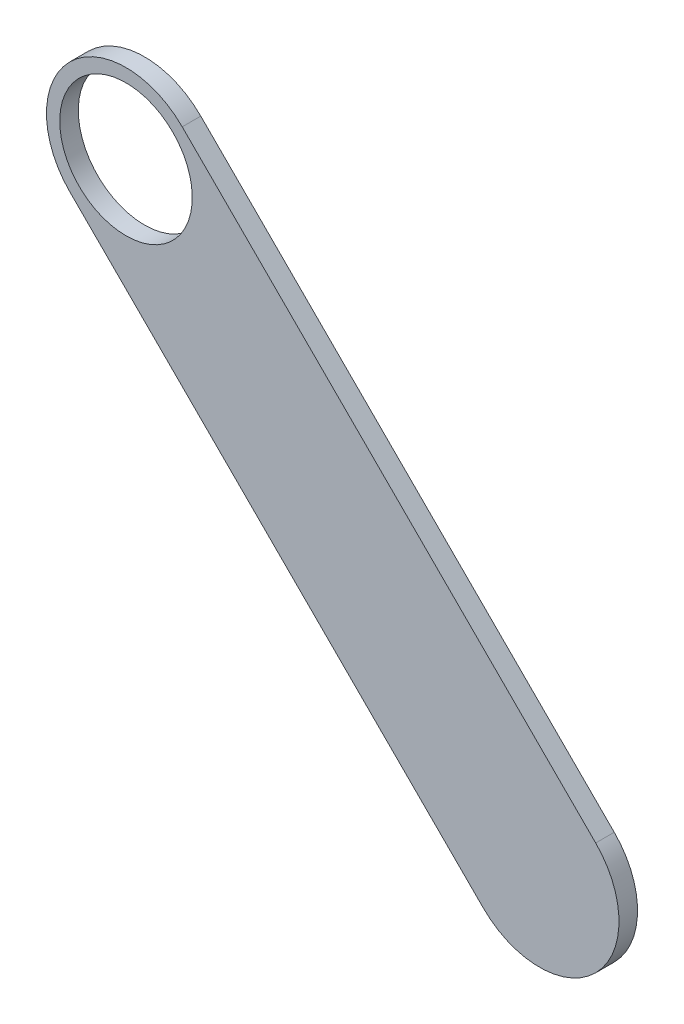
ISO-10303-21;
HEADER;
FILE_DESCRIPTION(('STEP AP214'),'2;1');
FILE_NAME('part.step','',(''),(''),'','','');
FILE_SCHEMA(('AUTOMOTIVE_DESIGN { 1 0 10303 214 1 1 1 1 }'));
ENDSEC;
DATA;
#1=APPLICATION_CONTEXT('core data for automotive mechanical design processes');
#2=APPLICATION_PROTOCOL_DEFINITION('international standard','automotive_design',2000,#1);
#3=PRODUCT_CONTEXT('',#1,'mechanical');
#4=PRODUCT('Part','Part','',(#3));
#5=PRODUCT_RELATED_PRODUCT_CATEGORY('part','',(#4));
#6=PRODUCT_DEFINITION_FORMATION('','',#4);
#7=PRODUCT_DEFINITION_CONTEXT('part definition',#1,'design');
#8=PRODUCT_DEFINITION('design','',#6,#7);
#9=PRODUCT_DEFINITION_SHAPE('','',#8);
#10=(LENGTH_UNIT() NAMED_UNIT(*) SI_UNIT(.MILLI.,.METRE.));
#11=(NAMED_UNIT(*) PLANE_ANGLE_UNIT() SI_UNIT($,.RADIAN.));
#12=(NAMED_UNIT(*) SI_UNIT($,.STERADIAN.) SOLID_ANGLE_UNIT());
#13=UNCERTAINTY_MEASURE_WITH_UNIT(LENGTH_MEASURE(1.E-05),#10,'distance_accuracy_value','');
#14=(GEOMETRIC_REPRESENTATION_CONTEXT(3) GLOBAL_UNCERTAINTY_ASSIGNED_CONTEXT((#13)) GLOBAL_UNIT_ASSIGNED_CONTEXT((#10,
#11,#12)) REPRESENTATION_CONTEXT('',''));
#15=CARTESIAN_POINT('',(0.,0.,0.));
#16=DIRECTION('',(0.,0.,1.));
#17=DIRECTION('',(1.,0.,0.));
#18=AXIS2_PLACEMENT_3D('',#15,#16,#17);
#19=CARTESIAN_POINT('',(132.67,-119.85,-0.045));
#20=DIRECTION('',(0.,0.,-1.));
#21=DIRECTION('',(0.,-1.,0.));
#22=AXIS2_PLACEMENT_3D('',#19,#20,#21);
#23=CYLINDRICAL_SURFACE('',#22,0.125);
#24=CARTESIAN_POINT('',(132.67,-119.85,-0.035));
#25=DIRECTION('',(0.,0.,-1.));
#26=DIRECTION('',(0.,-1.,0.));
#27=AXIS2_PLACEMENT_3D('',#24,#25,#26);
#28=CIRCLE('',#27,0.125);
#29=CARTESIAN_POINT('',(132.67,-119.975,-0.035));
#30=VERTEX_POINT('',#29);
#31=EDGE_CURVE('E86',#30,#30,#28,.T.);
#32=ORIENTED_EDGE('',*,*,#31,.T.);
#33=DIRECTION('',(0.,0.,1.));
#34=VECTOR('',#33,1.);
#35=CARTESIAN_POINT('',(132.67,-119.975,-0.045));
#36=LINE('',#35,#34);
#37=CARTESIAN_POINT('',(132.67,-119.975,0.));
#38=VERTEX_POINT('',#37);
#39=EDGE_CURVE('E11',#30,#38,#36,.T.);
#40=ORIENTED_EDGE('',*,*,#39,.T.);
#41=CARTESIAN_POINT('',(132.67,-119.85,0.));
#42=DIRECTION('',(0.,0.,-1.));
#43=DIRECTION('',(0.,-1.,0.));
#44=AXIS2_PLACEMENT_3D('',#41,#42,#43);
#45=CIRCLE('',#44,0.125);
#46=EDGE_CURVE('E25',#38,#38,#45,.T.);
#47=ORIENTED_EDGE('',*,*,#46,.F.);
#48=ORIENTED_EDGE('',*,*,#39,.F.);
#49=EDGE_LOOP('',(#32,#40,#47,#48));
#50=FACE_BOUND('',#49,.T.);
#51=ADVANCED_FACE('F17',(#50),#23,.F.);
#52=CARTESIAN_POINT('',(132.563933,-119.956066,-0.035));
#53=DIRECTION('',(0.707106781186548,0.707106781186548,0.));
#54=DIRECTION('',(0.,0.,-1.));
#55=AXIS2_PLACEMENT_3D('',#52,#53,#54);
#56=PLANE('',#55);
#57=DIRECTION('',(0.707106781186548,-0.707106781186548,0.));
#58=VECTOR('',#57,1.);
#59=CARTESIAN_POINT('',(132.563933,-119.956066,-0.035));
#60=LINE('',#59,#58);
#61=CARTESIAN_POINT('',(132.563933,-119.956066,-0.035));
#62=VERTEX_POINT('',#61);
#63=CARTESIAN_POINT('',(133.343933,-120.736066,-0.035));
#64=VERTEX_POINT('',#63);
#65=EDGE_CURVE('E91',#62,#64,#60,.T.);
#66=ORIENTED_EDGE('',*,*,#65,.T.);
#67=DIRECTION('',(0.,0.,1.));
#68=VECTOR('',#67,1.);
#69=CARTESIAN_POINT('',(133.343933,-120.736066,-0.035));
#70=LINE('',#69,#68);
#71=CARTESIAN_POINT('',(133.343933,-120.736066,0.));
#72=VERTEX_POINT('',#71);
#73=EDGE_CURVE('E89',#64,#72,#70,.T.);
#74=ORIENTED_EDGE('',*,*,#73,.T.);
#75=DIRECTION('',(0.707106781186548,-0.707106781186548,0.));
#76=VECTOR('',#75,1.);
#77=CARTESIAN_POINT('',(132.563933,-119.956066,0.));
#78=LINE('',#77,#76);
#79=CARTESIAN_POINT('',(132.563933,-119.956066,0.));
#80=VERTEX_POINT('',#79);
#81=EDGE_CURVE('E74',#80,#72,#78,.T.);
#82=ORIENTED_EDGE('',*,*,#81,.F.);
#83=DIRECTION('',(0.,0.,1.));
#84=VECTOR('',#83,1.);
#85=CARTESIAN_POINT('',(132.563933,-119.956066,-0.035));
#86=LINE('',#85,#84);
#87=EDGE_CURVE('E116',#62,#80,#86,.T.);
#88=ORIENTED_EDGE('',*,*,#87,.F.);
#89=EDGE_LOOP('',(#66,#74,#82,#88));
#90=FACE_BOUND('',#89,.T.);
#91=ADVANCED_FACE('F90',(#90),#56,.F.);
#92=CARTESIAN_POINT('',(133.556066,-120.523933,0.));
#93=DIRECTION('',(0.,0.,1.));
#94=DIRECTION('',(1.,0.,0.));
#95=AXIS2_PLACEMENT_3D('',#92,#93,#94);
#96=PLANE('',#95);
#97=ORIENTED_EDGE('',*,*,#46,.T.);
#98=EDGE_LOOP('',(#97));
#99=FACE_BOUND('',#98,.T.);
#100=DIRECTION('',(-0.707106781186548,0.707106781186548,0.));
#101=VECTOR('',#100,1.);
#102=CARTESIAN_POINT('',(133.556066,-120.523933,0.));
#103=LINE('',#102,#101);
#104=CARTESIAN_POINT('',(133.556066,-120.523933,0.));
#105=VERTEX_POINT('',#104);
#106=CARTESIAN_POINT('',(132.776066,-119.743933,0.));
#107=VERTEX_POINT('',#106);
#108=EDGE_CURVE('E165',#105,#107,#103,.T.);
#109=ORIENTED_EDGE('',*,*,#108,.T.);
#110=CARTESIAN_POINT('',(132.6699995,-119.8499995,0.));
#111=DIRECTION('',(0.,0.,1.));
#112=DIRECTION('',(0.707106781186548,0.707106781186548,0.));
#113=AXIS2_PLACEMENT_3D('',#110,#111,#112);
#114=CIRCLE('',#113,0.150000682813);
#115=EDGE_CURVE('E81',#107,#80,#114,.T.);
#116=ORIENTED_EDGE('',*,*,#115,.T.);
#117=ORIENTED_EDGE('',*,*,#81,.T.);
#118=CARTESIAN_POINT('',(133.4499995,-120.6299995,0.));
#119=DIRECTION('',(0.,0.,1.));
#120=DIRECTION('',(-0.707106781186548,-0.707106781186548,0.));
#121=AXIS2_PLACEMENT_3D('',#118,#119,#120);
#122=CIRCLE('',#121,0.150000682813);
#123=EDGE_CURVE('E79',#72,#105,#122,.T.);
#124=ORIENTED_EDGE('',*,*,#123,.T.);
#125=EDGE_LOOP('',(#109,#116,#117,#124));
#126=FACE_BOUND('',#125,.T.);
#127=ADVANCED_FACE('F77',(#99,#126),#96,.T.);
#128=CARTESIAN_POINT('',(133.556066,-120.523933,-0.035));
#129=DIRECTION('',(0.,0.,1.));
#130=DIRECTION('',(1.,0.,0.));
#131=AXIS2_PLACEMENT_3D('',#128,#129,#130);
#132=PLANE('',#131);
#133=ORIENTED_EDGE('',*,*,#31,.F.);
#134=EDGE_LOOP('',(#133));
#135=FACE_BOUND('',#134,.T.);
#136=CARTESIAN_POINT('',(133.4499995,-120.6299995,-0.035));
#137=DIRECTION('',(0.,0.,1.));
#138=DIRECTION('',(-0.707106781186548,-0.707106781186548,0.));
#139=AXIS2_PLACEMENT_3D('',#136,#137,#138);
#140=CIRCLE('',#139,0.150000682813);
#141=CARTESIAN_POINT('',(133.556066,-120.523933,-0.035));
#142=VERTEX_POINT('',#141);
#143=EDGE_CURVE('E102',#64,#142,#140,.T.);
#144=ORIENTED_EDGE('',*,*,#143,.F.);
#145=ORIENTED_EDGE('',*,*,#65,.F.);
#146=CARTESIAN_POINT('',(132.6699995,-119.8499995,-0.035));
#147=DIRECTION('',(0.,0.,1.));
#148=DIRECTION('',(0.707106781186548,0.707106781186548,0.));
#149=AXIS2_PLACEMENT_3D('',#146,#147,#148);
#150=CIRCLE('',#149,0.150000682813);
#151=CARTESIAN_POINT('',(132.776066,-119.743933,-0.035));
#152=VERTEX_POINT('',#151);
#153=EDGE_CURVE('E95',#152,#62,#150,.T.);
#154=ORIENTED_EDGE('',*,*,#153,.F.);
#155=DIRECTION('',(-0.707106781186548,0.707106781186548,0.));
#156=VECTOR('',#155,1.);
#157=CARTESIAN_POINT('',(133.556066,-120.523933,-0.035));
#158=LINE('',#157,#156);
#159=EDGE_CURVE('E156',#142,#152,#158,.T.);
#160=ORIENTED_EDGE('',*,*,#159,.F.);
#161=EDGE_LOOP('',(#144,#145,#154,#160));
#162=FACE_BOUND('',#161,.T.);
#163=ADVANCED_FACE('F135',(#135,#162),#132,.F.);
#164=CARTESIAN_POINT('',(132.6699995,-119.8499995,-0.035));
#165=DIRECTION('',(0.,0.,-1.));
#166=DIRECTION('',(0.707106781186548,0.707106781186548,0.));
#167=AXIS2_PLACEMENT_3D('',#164,#165,#166);
#168=CYLINDRICAL_SURFACE('',#167,0.150000682813);
#169=ORIENTED_EDGE('',*,*,#153,.T.);
#170=ORIENTED_EDGE('',*,*,#87,.T.);
#171=ORIENTED_EDGE('',*,*,#115,.F.);
#172=DIRECTION('',(0.,0.,1.));
#173=VECTOR('',#172,1.);
#174=CARTESIAN_POINT('',(132.776066,-119.743933,-0.035));
#175=LINE('',#174,#173);
#176=EDGE_CURVE('E158',#152,#107,#175,.T.);
#177=ORIENTED_EDGE('',*,*,#176,.F.);
#178=EDGE_LOOP('',(#169,#170,#171,#177));
#179=FACE_BOUND('',#178,.T.);
#180=ADVANCED_FACE('F139',(#179),#168,.T.);
#181=CARTESIAN_POINT('',(133.4499995,-120.6299995,-0.035));
#182=DIRECTION('',(0.,0.,-1.));
#183=DIRECTION('',(-0.707106781186548,-0.707106781186548,0.));
#184=AXIS2_PLACEMENT_3D('',#181,#182,#183);
#185=CYLINDRICAL_SURFACE('',#184,0.150000682813);
#186=ORIENTED_EDGE('',*,*,#143,.T.);
#187=DIRECTION('',(0.,0.,1.));
#188=VECTOR('',#187,1.);
#189=CARTESIAN_POINT('',(133.556066,-120.523933,-0.035));
#190=LINE('',#189,#188);
#191=EDGE_CURVE('E99',#142,#105,#190,.T.);
#192=ORIENTED_EDGE('',*,*,#191,.T.);
#193=ORIENTED_EDGE('',*,*,#123,.F.);
#194=ORIENTED_EDGE('',*,*,#73,.F.);
#195=EDGE_LOOP('',(#186,#192,#193,#194));
#196=FACE_BOUND('',#195,.T.);
#197=ADVANCED_FACE('F97',(#196),#185,.T.);
#198=CARTESIAN_POINT('',(133.556066,-120.523933,-0.035));
#199=DIRECTION('',(-0.707106781186548,-0.707106781186548,0.));
#200=DIRECTION('',(-0.707106781186548,0.707106781186548,0.));
#201=AXIS2_PLACEMENT_3D('',#198,#199,#200);
#202=PLANE('',#201);
#203=ORIENTED_EDGE('',*,*,#159,.T.);
#204=ORIENTED_EDGE('',*,*,#176,.T.);
#205=ORIENTED_EDGE('',*,*,#108,.F.);
#206=ORIENTED_EDGE('',*,*,#191,.F.);
#207=EDGE_LOOP('',(#203,#204,#205,#206));
#208=FACE_BOUND('',#207,.T.);
#209=ADVANCED_FACE('F147',(#208),#202,.F.);
#210=CLOSED_SHELL('',(#51,#91,#127,#163,#180,#197,#209));
#211=MANIFOLD_SOLID_BREP('B1',#210);
#212=ADVANCED_BREP_SHAPE_REPRESENTATION('',(#18,#211),#14);
#213=SHAPE_DEFINITION_REPRESENTATION(#9,#212);
ENDSEC;
END-ISO-10303-21;
